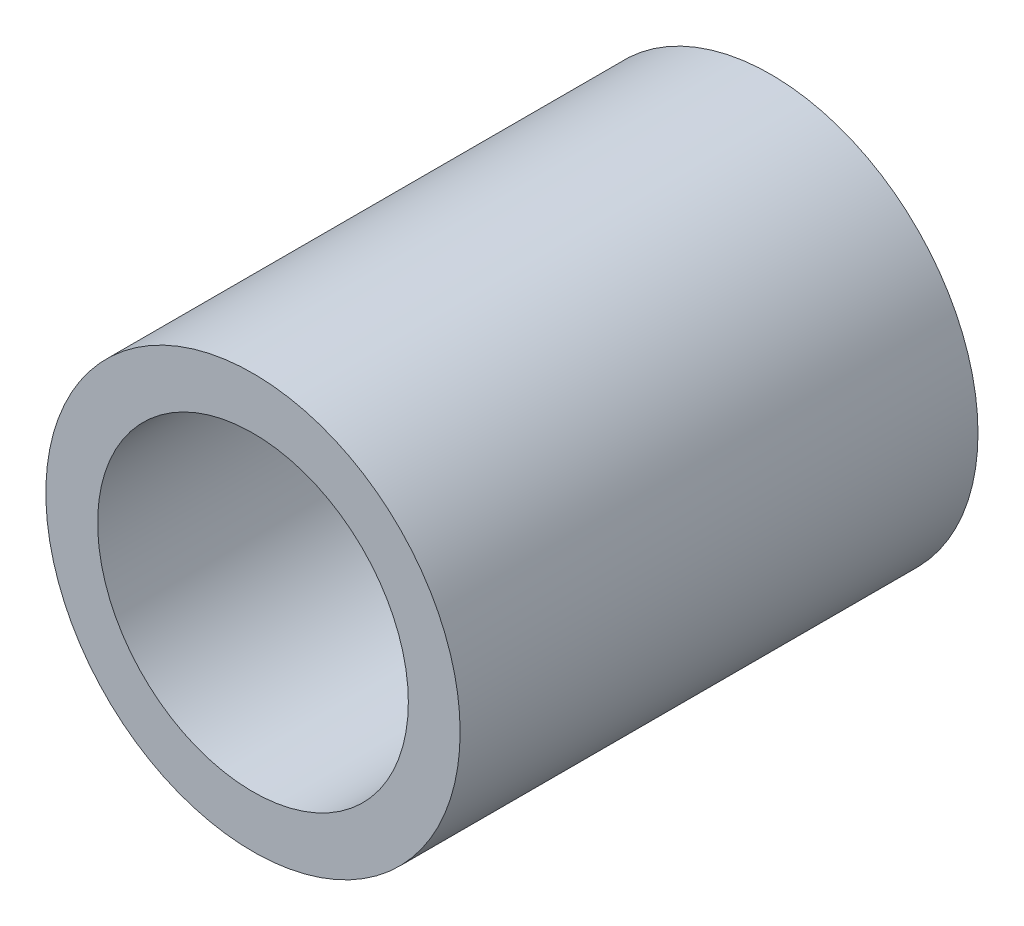
ISO-10303-21;
HEADER;
FILE_DESCRIPTION(('STEP AP214'),'2;1');
FILE_NAME('part.step','',(''),(''),'','','');
FILE_SCHEMA(('AUTOMOTIVE_DESIGN { 1 0 10303 214 1 1 1 1 }'));
ENDSEC;
DATA;
#1=APPLICATION_CONTEXT('core data for automotive mechanical design processes');
#2=APPLICATION_PROTOCOL_DEFINITION('international standard','automotive_design',2000,#1);
#3=PRODUCT_CONTEXT('',#1,'mechanical');
#4=PRODUCT('Part','Part','',(#3));
#5=PRODUCT_RELATED_PRODUCT_CATEGORY('part','',(#4));
#6=PRODUCT_DEFINITION_FORMATION('','',#4);
#7=PRODUCT_DEFINITION_CONTEXT('part definition',#1,'design');
#8=PRODUCT_DEFINITION('design','',#6,#7);
#9=PRODUCT_DEFINITION_SHAPE('','',#8);
#10=(LENGTH_UNIT() NAMED_UNIT(*) SI_UNIT(.MILLI.,.METRE.));
#11=(NAMED_UNIT(*) PLANE_ANGLE_UNIT() SI_UNIT($,.RADIAN.));
#12=(NAMED_UNIT(*) SI_UNIT($,.STERADIAN.) SOLID_ANGLE_UNIT());
#13=UNCERTAINTY_MEASURE_WITH_UNIT(LENGTH_MEASURE(1.E-05),#10,'distance_accuracy_value','');
#14=(GEOMETRIC_REPRESENTATION_CONTEXT(3) GLOBAL_UNCERTAINTY_ASSIGNED_CONTEXT((#13)) GLOBAL_UNIT_ASSIGNED_CONTEXT((#10,
#11,#12)) REPRESENTATION_CONTEXT('',''));
#15=CARTESIAN_POINT('',(0.,0.,0.));
#16=DIRECTION('',(0.,0.,1.));
#17=DIRECTION('',(1.,0.,0.));
#18=AXIS2_PLACEMENT_3D('',#15,#16,#17);
#19=CARTESIAN_POINT('',(0.,0.,5.));
#20=DIRECTION('',(0.,0.,1.));
#21=DIRECTION('',(1.,0.,0.));
#22=AXIS2_PLACEMENT_3D('',#19,#20,#21);
#23=PLANE('',#22);
#24=CARTESIAN_POINT('',(0.,0.,5.));
#25=DIRECTION('',(0.,0.,1.));
#26=DIRECTION('',(1.,0.,0.));
#27=AXIS2_PLACEMENT_3D('',#24,#25,#26);
#28=CIRCLE('',#27,2.);
#29=CARTESIAN_POINT('',(2.,0.,5.));
#30=VERTEX_POINT('',#29);
#31=EDGE_CURVE('E10',#30,#30,#28,.T.);
#32=ORIENTED_EDGE('',*,*,#31,.T.);
#33=EDGE_LOOP('',(#32));
#34=FACE_BOUND('',#33,.T.);
#35=CARTESIAN_POINT('',(0.,0.,5.));
#36=DIRECTION('',(0.,0.,1.));
#37=DIRECTION('',(1.,0.,0.));
#38=AXIS2_PLACEMENT_3D('',#35,#36,#37);
#39=CIRCLE('',#38,1.5);
#40=CARTESIAN_POINT('',(1.5,0.,5.));
#41=VERTEX_POINT('',#40);
#42=EDGE_CURVE('E42',#41,#41,#39,.T.);
#43=ORIENTED_EDGE('',*,*,#42,.F.);
#44=EDGE_LOOP('',(#43));
#45=FACE_BOUND('',#44,.T.);
#46=ADVANCED_FACE('F31',(#34,#45),#23,.T.);
#47=CARTESIAN_POINT('',(0.,0.,0.));
#48=DIRECTION('',(0.,0.,1.));
#49=DIRECTION('',(1.,0.,0.));
#50=AXIS2_PLACEMENT_3D('',#47,#48,#49);
#51=PLANE('',#50);
#52=CARTESIAN_POINT('',(0.,0.,0.));
#53=DIRECTION('',(0.,0.,1.));
#54=DIRECTION('',(1.,0.,0.));
#55=AXIS2_PLACEMENT_3D('',#52,#53,#54);
#56=CIRCLE('',#55,2.);
#57=CARTESIAN_POINT('',(2.,0.,0.));
#58=VERTEX_POINT('',#57);
#59=EDGE_CURVE('E35',#58,#58,#56,.T.);
#60=ORIENTED_EDGE('',*,*,#59,.F.);
#61=EDGE_LOOP('',(#60));
#62=FACE_BOUND('',#61,.T.);
#63=CARTESIAN_POINT('',(0.,0.,0.));
#64=DIRECTION('',(0.,0.,1.));
#65=DIRECTION('',(1.,0.,0.));
#66=AXIS2_PLACEMENT_3D('',#63,#64,#65);
#67=CIRCLE('',#66,1.5);
#68=CARTESIAN_POINT('',(1.5,0.,0.));
#69=VERTEX_POINT('',#68);
#70=EDGE_CURVE('E44',#69,#69,#67,.T.);
#71=ORIENTED_EDGE('',*,*,#70,.T.);
#72=EDGE_LOOP('',(#71));
#73=FACE_BOUND('',#72,.T.);
#74=ADVANCED_FACE('F54',(#62,#73),#51,.F.);
#75=CARTESIAN_POINT('',(0.,0.,5.));
#76=DIRECTION('',(0.,0.,-1.));
#77=DIRECTION('',(-1.,0.,0.));
#78=AXIS2_PLACEMENT_3D('',#75,#76,#77);
#79=CYLINDRICAL_SURFACE('',#78,2.);
#80=ORIENTED_EDGE('',*,*,#31,.F.);
#81=EDGE_LOOP('',(#80));
#82=FACE_BOUND('',#81,.T.);
#83=ORIENTED_EDGE('',*,*,#59,.T.);
#84=EDGE_LOOP('',(#83));
#85=FACE_BOUND('',#84,.T.);
#86=ADVANCED_FACE('F33',(#82,#85),#79,.T.);
#87=CARTESIAN_POINT('',(0.,0.,5.));
#88=DIRECTION('',(0.,0.,-1.));
#89=DIRECTION('',(-1.,0.,0.));
#90=AXIS2_PLACEMENT_3D('',#87,#88,#89);
#91=CYLINDRICAL_SURFACE('',#90,1.5);
#92=ORIENTED_EDGE('',*,*,#42,.T.);
#93=EDGE_LOOP('',(#92));
#94=FACE_BOUND('',#93,.T.);
#95=ORIENTED_EDGE('',*,*,#70,.F.);
#96=EDGE_LOOP('',(#95));
#97=FACE_BOUND('',#96,.T.);
#98=ADVANCED_FACE('F50',(#94,#97),#91,.F.);
#99=CLOSED_SHELL('',(#46,#74,#86,#98));
#100=MANIFOLD_SOLID_BREP('B2',#99);
#101=ADVANCED_BREP_SHAPE_REPRESENTATION('',(#18,#100),#14);
#102=SHAPE_DEFINITION_REPRESENTATION(#9,#101);
ENDSEC;
END-ISO-10303-21;
